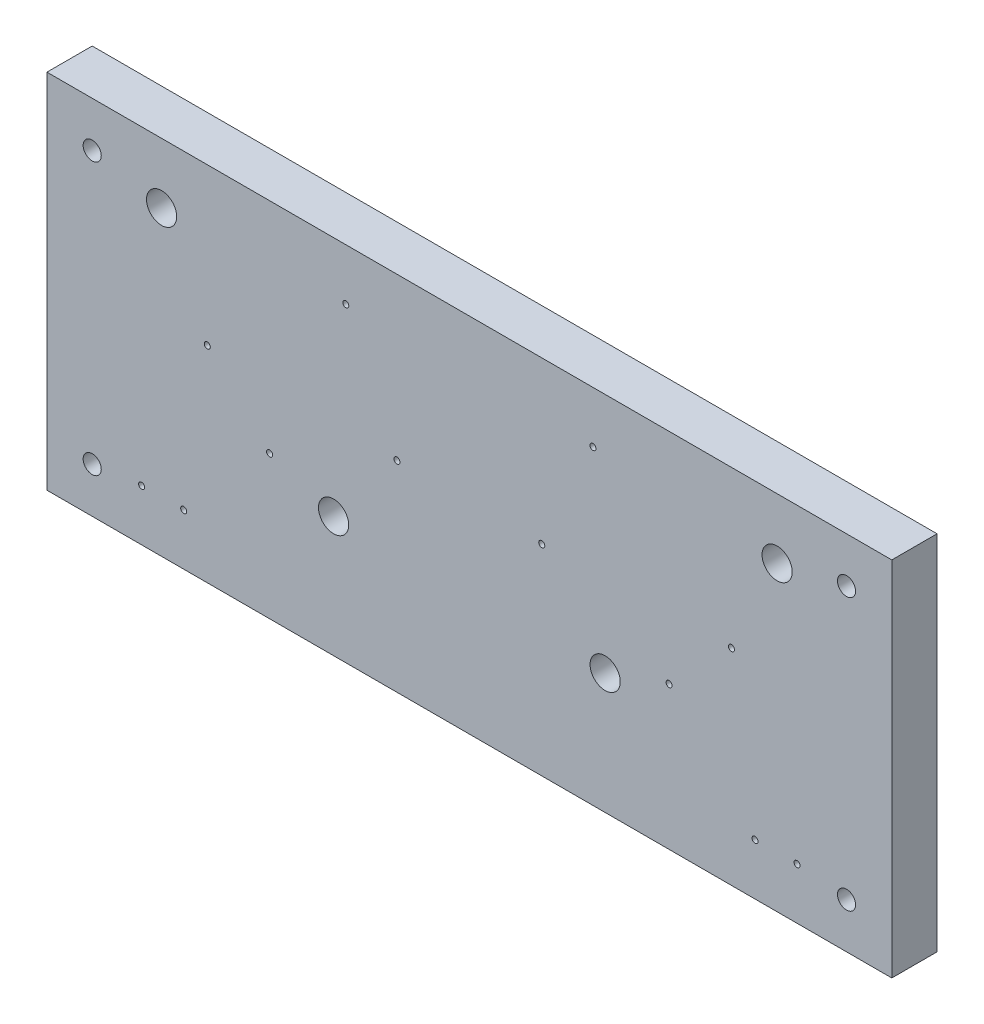
ISO-10303-21;
HEADER;
FILE_DESCRIPTION(('STEP AP214'),'2;1');
FILE_NAME('part.step','',(''),(''),'','','');
FILE_SCHEMA(('AUTOMOTIVE_DESIGN { 1 0 10303 214 1 1 1 1 }'));
ENDSEC;
DATA;
#1=APPLICATION_CONTEXT('core data for automotive mechanical design processes');
#2=APPLICATION_PROTOCOL_DEFINITION('international standard','automotive_design',2000,#1);
#3=PRODUCT_CONTEXT('',#1,'mechanical');
#4=PRODUCT('Part','Part','',(#3));
#5=PRODUCT_RELATED_PRODUCT_CATEGORY('part','',(#4));
#6=PRODUCT_DEFINITION_FORMATION('','',#4);
#7=PRODUCT_DEFINITION_CONTEXT('part definition',#1,'design');
#8=PRODUCT_DEFINITION('design','',#6,#7);
#9=PRODUCT_DEFINITION_SHAPE('','',#8);
#10=(LENGTH_UNIT() NAMED_UNIT(*) SI_UNIT(.MILLI.,.METRE.));
#11=(NAMED_UNIT(*) PLANE_ANGLE_UNIT() SI_UNIT($,.RADIAN.));
#12=(NAMED_UNIT(*) SI_UNIT($,.STERADIAN.) SOLID_ANGLE_UNIT());
#13=UNCERTAINTY_MEASURE_WITH_UNIT(LENGTH_MEASURE(1.E-05),#10,'distance_accuracy_value','');
#14=(GEOMETRIC_REPRESENTATION_CONTEXT(3) GLOBAL_UNCERTAINTY_ASSIGNED_CONTEXT((#13)) GLOBAL_UNIT_ASSIGNED_CONTEXT((#10,
#11,#12)) REPRESENTATION_CONTEXT('',''));
#15=CARTESIAN_POINT('',(0.,0.,0.));
#16=DIRECTION('',(0.,0.,1.));
#17=DIRECTION('',(1.,0.,0.));
#18=AXIS2_PLACEMENT_3D('',#15,#16,#17);
#19=CARTESIAN_POINT('',(0.,0.,15.));
#20=DIRECTION('',(0.,0.,-1.));
#21=DIRECTION('',(-1.,0.,0.));
#22=AXIS2_PLACEMENT_3D('',#19,#20,#21);
#23=PLANE('',#22);
#24=CARTESIAN_POINT('',(66.1972555919681,-12.5278266131575,15.));
#25=DIRECTION('',(0.,0.,1.));
#26=DIRECTION('',(1.,0.,0.));
#27=AXIS2_PLACEMENT_3D('',#24,#25,#26);
#28=CIRCLE('',#27,0.999999999999998);
#29=CARTESIAN_POINT('',(67.1972555919681,-12.5278266131575,15.));
#30=VERTEX_POINT('',#29);
#31=EDGE_CURVE('E261',#30,#30,#28,.T.);
#32=ORIENTED_EDGE('',*,*,#31,.F.);
#33=EDGE_LOOP('',(#32));
#34=FACE_BOUND('',#33,.T.);
#35=CARTESIAN_POINT('',(94.6633318787199,-43.,15.));
#36=DIRECTION('',(0.,0.,1.));
#37=DIRECTION('',(1.,0.,0.));
#38=AXIS2_PLACEMENT_3D('',#35,#36,#37);
#39=CIRCLE('',#38,0.999999999999998);
#40=CARTESIAN_POINT('',(95.6633318787199,-43.,15.));
#41=VERTEX_POINT('',#40);
#42=EDGE_CURVE('E260',#41,#41,#39,.T.);
#43=ORIENTED_EDGE('',*,*,#42,.F.);
#44=EDGE_LOOP('',(#43));
#45=FACE_BOUND('',#44,.T.);
#46=CARTESIAN_POINT('',(45.,-20.,15.));
#47=DIRECTION('',(0.,0.,1.));
#48=DIRECTION('',(1.,0.,0.));
#49=AXIS2_PLACEMENT_3D('',#46,#47,#48);
#50=CIRCLE('',#49,4.99999999999999);
#51=CARTESIAN_POINT('',(50.,-20.,15.));
#52=VERTEX_POINT('',#51);
#53=EDGE_CURVE('E280',#52,#52,#50,.F.);
#54=ORIENTED_EDGE('',*,*,#53,.T.);
#55=EDGE_LOOP('',(#54));
#56=FACE_BOUND('',#55,.T.);
#57=CARTESIAN_POINT('',(-102.,40.,15.));
#58=DIRECTION('',(0.,0.,1.));
#59=DIRECTION('',(1.,0.,0.));
#60=AXIS2_PLACEMENT_3D('',#57,#58,#59);
#61=CIRCLE('',#60,5.00000000000002);
#62=CARTESIAN_POINT('',(-97.,40.,15.));
#63=VERTEX_POINT('',#62);
#64=EDGE_CURVE('E274',#63,#63,#61,.T.);
#65=ORIENTED_EDGE('',*,*,#64,.F.);
#66=EDGE_LOOP('',(#65));
#67=FACE_BOUND('',#66,.T.);
#68=CARTESIAN_POINT('',(108.600249206091,-43.,15.));
#69=DIRECTION('',(0.,0.,-1.));
#70=DIRECTION('',(-1.,0.,0.));
#71=AXIS2_PLACEMENT_3D('',#68,#69,#70);
#72=CIRCLE('',#71,0.999999999999998);
#73=CARTESIAN_POINT('',(107.600249206091,-43.,15.));
#74=VERTEX_POINT('',#73);
#75=EDGE_CURVE('E264',#74,#74,#72,.T.);
#76=ORIENTED_EDGE('',*,*,#75,.T.);
#77=EDGE_LOOP('',(#76));
#78=FACE_BOUND('',#77,.T.);
#79=CARTESIAN_POINT('',(-23.9978729836266,6.52759051078482,15.));
#80=DIRECTION('',(0.,0.,1.));
#81=DIRECTION('',(1.,0.,0.));
#82=AXIS2_PLACEMENT_3D('',#79,#80,#81);
#83=CIRCLE('',#82,0.999999999999998);
#84=CARTESIAN_POINT('',(-22.9978729836266,6.52759051078482,15.));
#85=VERTEX_POINT('',#84);
#86=EDGE_CURVE('E496',#85,#85,#83,.T.);
#87=ORIENTED_EDGE('',*,*,#86,.F.);
#88=EDGE_LOOP('',(#87));
#89=FACE_BOUND('',#88,.T.);
#90=CARTESIAN_POINT('',(-86.860735425717,8.14261119141876,15.));
#91=DIRECTION('',(0.,0.,1.));
#92=DIRECTION('',(1.,0.,0.));
#93=AXIS2_PLACEMENT_3D('',#90,#91,#92);
#94=CIRCLE('',#93,0.999999999999998);
#95=CARTESIAN_POINT('',(-85.860735425717,8.14261119141876,15.));
#96=VERTEX_POINT('',#95);
#97=EDGE_CURVE('E500',#96,#96,#94,.T.);
#98=ORIENTED_EDGE('',*,*,#97,.F.);
#99=EDGE_LOOP('',(#98));
#100=FACE_BOUND('',#99,.T.);
#101=CARTESIAN_POINT('',(-108.606917327371,-43.,15.));
#102=DIRECTION('',(0.,0.,1.));
#103=DIRECTION('',(1.,0.,0.));
#104=AXIS2_PLACEMENT_3D('',#101,#102,#103);
#105=CIRCLE('',#104,0.999999999999998);
#106=CARTESIAN_POINT('',(-107.606917327371,-43.,15.));
#107=VERTEX_POINT('',#106);
#108=EDGE_CURVE('E504',#107,#107,#105,.T.);
#109=ORIENTED_EDGE('',*,*,#108,.F.);
#110=EDGE_LOOP('',(#109));
#111=FACE_BOUND('',#110,.T.);
#112=CARTESIAN_POINT('',(-124.999999999999,-45.,15.));
#113=DIRECTION('',(0.,0.,1.));
#114=DIRECTION('',(1.,0.,0.));
#115=AXIS2_PLACEMENT_3D('',#112,#113,#114);
#116=CIRCLE('',#115,3.00000000000001);
#117=CARTESIAN_POINT('',(-121.999999999999,-45.,15.));
#118=VERTEX_POINT('',#117);
#119=EDGE_CURVE('E160',#118,#118,#116,.T.);
#120=ORIENTED_EDGE('',*,*,#119,.F.);
#121=EDGE_LOOP('',(#120));
#122=FACE_BOUND('',#121,.T.);
#123=CARTESIAN_POINT('',(125.000000000001,-45.,15.));
#124=DIRECTION('',(0.,0.,1.));
#125=DIRECTION('',(1.,0.,0.));
#126=AXIS2_PLACEMENT_3D('',#123,#124,#125);
#127=CIRCLE('',#126,2.99999999999999);
#128=CARTESIAN_POINT('',(128.000000000001,-45.,15.));
#129=VERTEX_POINT('',#128);
#130=EDGE_CURVE('E169',#129,#129,#127,.T.);
#131=ORIENTED_EDGE('',*,*,#130,.F.);
#132=EDGE_LOOP('',(#131));
#133=FACE_BOUND('',#132,.T.);
#134=CARTESIAN_POINT('',(125.,45.,15.));
#135=DIRECTION('',(0.,0.,1.));
#136=DIRECTION('',(1.,0.,0.));
#137=AXIS2_PLACEMENT_3D('',#134,#135,#136);
#138=CIRCLE('',#137,2.99999999999999);
#139=CARTESIAN_POINT('',(128.,45.,15.));
#140=VERTEX_POINT('',#139);
#141=EDGE_CURVE('E175',#140,#140,#138,.T.);
#142=ORIENTED_EDGE('',*,*,#141,.F.);
#143=EDGE_LOOP('',(#142));
#144=FACE_BOUND('',#143,.T.);
#145=CARTESIAN_POINT('',(-125.,45.,15.));
#146=DIRECTION('',(0.,0.,1.));
#147=DIRECTION('',(1.,0.,0.));
#148=AXIS2_PLACEMENT_3D('',#145,#146,#147);
#149=CIRCLE('',#148,3.00000000000001);
#150=CARTESIAN_POINT('',(-122.,45.,15.));
#151=VERTEX_POINT('',#150);
#152=EDGE_CURVE('E103',#151,#151,#149,.T.);
#153=ORIENTED_EDGE('',*,*,#152,.F.);
#154=EDGE_LOOP('',(#153));
#155=FACE_BOUND('',#154,.T.);
#156=DIRECTION('',(0.,1.,0.));
#157=VECTOR('',#156,1.);
#158=CARTESIAN_POINT('',(140.,-60.,15.));
#159=LINE('',#158,#157);
#160=CARTESIAN_POINT('',(140.,-60.,15.));
#161=VERTEX_POINT('',#160);
#162=CARTESIAN_POINT('',(140.,60.,15.));
#163=VERTEX_POINT('',#162);
#164=EDGE_CURVE('E87',#161,#163,#159,.T.);
#165=ORIENTED_EDGE('',*,*,#164,.T.);
#166=DIRECTION('',(-1.,0.,0.));
#167=VECTOR('',#166,1.);
#168=CARTESIAN_POINT('',(-140.,60.,15.));
#169=LINE('',#168,#167);
#170=CARTESIAN_POINT('',(-140.,60.,15.));
#171=VERTEX_POINT('',#170);
#172=EDGE_CURVE('E82',#163,#171,#169,.T.);
#173=ORIENTED_EDGE('',*,*,#172,.T.);
#174=DIRECTION('',(0.,-1.,0.));
#175=VECTOR('',#174,1.);
#176=CARTESIAN_POINT('',(-140.,-60.,15.));
#177=LINE('',#176,#175);
#178=CARTESIAN_POINT('',(-140.,-60.,15.));
#179=VERTEX_POINT('',#178);
#180=EDGE_CURVE('E85',#171,#179,#177,.T.);
#181=ORIENTED_EDGE('',*,*,#180,.T.);
#182=DIRECTION('',(1.,0.,0.));
#183=VECTOR('',#182,1.);
#184=CARTESIAN_POINT('',(-140.,-60.,15.));
#185=LINE('',#184,#183);
#186=EDGE_CURVE('E52',#179,#161,#185,.T.);
#187=ORIENTED_EDGE('',*,*,#186,.T.);
#188=EDGE_LOOP('',(#165,#173,#181,#187));
#189=FACE_BOUND('',#188,.T.);
#190=CARTESIAN_POINT('',(102.,40.,15.));
#191=DIRECTION('',(0.,0.,1.));
#192=DIRECTION('',(1.,0.,0.));
#193=AXIS2_PLACEMENT_3D('',#190,#191,#192);
#194=CIRCLE('',#193,5.00000000000005);
#195=CARTESIAN_POINT('',(107.,40.,15.));
#196=VERTEX_POINT('',#195);
#197=EDGE_CURVE('E113',#196,#196,#194,.F.);
#198=ORIENTED_EDGE('',*,*,#197,.T.);
#199=EDGE_LOOP('',(#198));
#200=FACE_BOUND('',#199,.T.);
#201=CARTESIAN_POINT('',(-66.203923713249,-12.5278266131575,15.));
#202=DIRECTION('',(0.,0.,1.));
#203=DIRECTION('',(1.,0.,0.));
#204=AXIS2_PLACEMENT_3D('',#201,#202,#203);
#205=CIRCLE('',#204,0.999999999999998);
#206=CARTESIAN_POINT('',(-65.203923713249,-12.5278266131575,15.));
#207=VERTEX_POINT('',#206);
#208=EDGE_CURVE('E508',#207,#207,#205,.T.);
#209=ORIENTED_EDGE('',*,*,#208,.F.);
#210=EDGE_LOOP('',(#209));
#211=FACE_BOUND('',#210,.T.);
#212=CARTESIAN_POINT('',(-94.6699999999999,-43.,15.));
#213=DIRECTION('',(0.,0.,1.));
#214=DIRECTION('',(1.,0.,0.));
#215=AXIS2_PLACEMENT_3D('',#212,#213,#214);
#216=CIRCLE('',#215,0.999999999999998);
#217=CARTESIAN_POINT('',(-93.6699999999999,-43.,15.));
#218=VERTEX_POINT('',#217);
#219=EDGE_CURVE('E509',#218,#218,#216,.T.);
#220=ORIENTED_EDGE('',*,*,#219,.F.);
#221=EDGE_LOOP('',(#220));
#222=FACE_BOUND('',#221,.T.);
#223=CARTESIAN_POINT('',(-40.9612228496668,42.9056060975551,15.));
#224=DIRECTION('',(0.,0.,1.));
#225=DIRECTION('',(1.,0.,0.));
#226=AXIS2_PLACEMENT_3D('',#223,#224,#225);
#227=CIRCLE('',#226,0.999999999999998);
#228=CARTESIAN_POINT('',(-39.9612228496668,42.9056060975551,15.));
#229=VERTEX_POINT('',#228);
#230=EDGE_CURVE('E516',#229,#229,#227,.T.);
#231=ORIENTED_EDGE('',*,*,#230,.F.);
#232=EDGE_LOOP('',(#231));
#233=FACE_BOUND('',#232,.T.);
#234=CARTESIAN_POINT('',(40.9545547283859,42.9056060975552,15.));
#235=DIRECTION('',(0.,0.,1.));
#236=DIRECTION('',(1.,0.,0.));
#237=AXIS2_PLACEMENT_3D('',#234,#235,#236);
#238=CIRCLE('',#237,0.999999999999998);
#239=CARTESIAN_POINT('',(41.9545547283859,42.9056060975552,15.));
#240=VERTEX_POINT('',#239);
#241=EDGE_CURVE('E273',#240,#240,#238,.T.);
#242=ORIENTED_EDGE('',*,*,#241,.F.);
#243=EDGE_LOOP('',(#242));
#244=FACE_BOUND('',#243,.T.);
#245=CARTESIAN_POINT('',(-45.,-20.,15.));
#246=DIRECTION('',(0.,0.,1.));
#247=DIRECTION('',(1.,0.,0.));
#248=AXIS2_PLACEMENT_3D('',#245,#246,#247);
#249=CIRCLE('',#248,5.00000000000001);
#250=CARTESIAN_POINT('',(-40.,-20.,15.));
#251=VERTEX_POINT('',#250);
#252=EDGE_CURVE('E277',#251,#251,#249,.T.);
#253=ORIENTED_EDGE('',*,*,#252,.F.);
#254=EDGE_LOOP('',(#253));
#255=FACE_BOUND('',#254,.T.);
#256=CARTESIAN_POINT('',(86.8540673044364,8.14261119141895,15.));
#257=DIRECTION('',(0.,0.,1.));
#258=DIRECTION('',(1.,0.,0.));
#259=AXIS2_PLACEMENT_3D('',#256,#257,#258);
#260=CIRCLE('',#259,0.999999999999998);
#261=CARTESIAN_POINT('',(87.8540673044364,8.14261119141895,15.));
#262=VERTEX_POINT('',#261);
#263=EDGE_CURVE('E258',#262,#262,#260,.T.);
#264=ORIENTED_EDGE('',*,*,#263,.F.);
#265=EDGE_LOOP('',(#264));
#266=FACE_BOUND('',#265,.T.);
#267=CARTESIAN_POINT('',(23.9912048623457,6.52759051078482,15.));
#268=DIRECTION('',(0.,0.,1.));
#269=DIRECTION('',(1.,0.,0.));
#270=AXIS2_PLACEMENT_3D('',#267,#268,#269);
#271=CIRCLE('',#270,1.00000000000001);
#272=CARTESIAN_POINT('',(24.9912048623458,6.52759051078482,15.));
#273=VERTEX_POINT('',#272);
#274=EDGE_CURVE('E267',#273,#273,#271,.T.);
#275=ORIENTED_EDGE('',*,*,#274,.F.);
#276=EDGE_LOOP('',(#275));
#277=FACE_BOUND('',#276,.T.);
#278=ADVANCED_FACE('F33',(#34,#45,#56,#67,#78,#89,#100,#111,#122,#133,#144,#155,#189,#200,#211,
#222,#233,#244,#255,#266,#277),#23,.F.);
#279=CARTESIAN_POINT('',(0.,0.,0.));
#280=DIRECTION('',(0.,0.,-1.));
#281=DIRECTION('',(-1.,0.,0.));
#282=AXIS2_PLACEMENT_3D('',#279,#280,#281);
#283=PLANE('',#282);
#284=CARTESIAN_POINT('',(45.,-20.,0.));
#285=DIRECTION('',(0.,0.,-1.));
#286=DIRECTION('',(-1.,0.,0.));
#287=AXIS2_PLACEMENT_3D('',#284,#285,#286);
#288=CIRCLE('',#287,4.99999999999999);
#289=CARTESIAN_POINT('',(40.,-20.,0.));
#290=VERTEX_POINT('',#289);
#291=EDGE_CURVE('E143',#290,#290,#288,.F.);
#292=ORIENTED_EDGE('',*,*,#291,.T.);
#293=EDGE_LOOP('',(#292));
#294=FACE_BOUND('',#293,.T.);
#295=CARTESIAN_POINT('',(108.600249206091,-43.,0.));
#296=DIRECTION('',(0.,0.,-1.));
#297=DIRECTION('',(-1.,0.,0.));
#298=AXIS2_PLACEMENT_3D('',#295,#296,#297);
#299=CIRCLE('',#298,0.999999999999998);
#300=CARTESIAN_POINT('',(107.600249206091,-43.,0.));
#301=VERTEX_POINT('',#300);
#302=EDGE_CURVE('E134',#301,#301,#299,.F.);
#303=ORIENTED_EDGE('',*,*,#302,.T.);
#304=EDGE_LOOP('',(#303));
#305=FACE_BOUND('',#304,.T.);
#306=CARTESIAN_POINT('',(102.,40.,0.));
#307=DIRECTION('',(0.,0.,-1.));
#308=DIRECTION('',(-1.,0.,0.));
#309=AXIS2_PLACEMENT_3D('',#306,#307,#308);
#310=CIRCLE('',#309,5.00000000000005);
#311=CARTESIAN_POINT('',(97.,40.,0.));
#312=VERTEX_POINT('',#311);
#313=EDGE_CURVE('E109',#312,#312,#310,.F.);
#314=ORIENTED_EDGE('',*,*,#313,.T.);
#315=EDGE_LOOP('',(#314));
#316=FACE_BOUND('',#315,.T.);
#317=CARTESIAN_POINT('',(125.000000000001,-45.,0.));
#318=DIRECTION('',(0.,0.,1.));
#319=DIRECTION('',(1.,0.,0.));
#320=AXIS2_PLACEMENT_3D('',#317,#318,#319);
#321=CIRCLE('',#320,2.99999999999999);
#322=CARTESIAN_POINT('',(128.000000000001,-45.,0.));
#323=VERTEX_POINT('',#322);
#324=EDGE_CURVE('E165',#323,#323,#321,.T.);
#325=ORIENTED_EDGE('',*,*,#324,.T.);
#326=EDGE_LOOP('',(#325));
#327=FACE_BOUND('',#326,.T.);
#328=CARTESIAN_POINT('',(-125.,45.,0.));
#329=DIRECTION('',(0.,0.,1.));
#330=DIRECTION('',(1.,0.,0.));
#331=AXIS2_PLACEMENT_3D('',#328,#329,#330);
#332=CIRCLE('',#331,3.00000000000001);
#333=CARTESIAN_POINT('',(-122.,45.,0.));
#334=VERTEX_POINT('',#333);
#335=EDGE_CURVE('E178',#334,#334,#332,.T.);
#336=ORIENTED_EDGE('',*,*,#335,.T.);
#337=EDGE_LOOP('',(#336));
#338=FACE_BOUND('',#337,.T.);
#339=DIRECTION('',(0.,1.,0.));
#340=VECTOR('',#339,1.);
#341=CARTESIAN_POINT('',(140.,-60.,0.));
#342=LINE('',#341,#340);
#343=CARTESIAN_POINT('',(140.,-60.,0.));
#344=VERTEX_POINT('',#343);
#345=CARTESIAN_POINT('',(140.,60.,0.));
#346=VERTEX_POINT('',#345);
#347=EDGE_CURVE('E100',#344,#346,#342,.T.);
#348=ORIENTED_EDGE('',*,*,#347,.F.);
#349=DIRECTION('',(1.,0.,0.));
#350=VECTOR('',#349,1.);
#351=CARTESIAN_POINT('',(-140.,-60.,0.));
#352=LINE('',#351,#350);
#353=CARTESIAN_POINT('',(-140.,-60.,0.));
#354=VERTEX_POINT('',#353);
#355=EDGE_CURVE('E75',#354,#344,#352,.T.);
#356=ORIENTED_EDGE('',*,*,#355,.F.);
#357=DIRECTION('',(0.,-1.,0.));
#358=VECTOR('',#357,1.);
#359=CARTESIAN_POINT('',(-140.,-60.,0.));
#360=LINE('',#359,#358);
#361=CARTESIAN_POINT('',(-140.,60.,0.));
#362=VERTEX_POINT('',#361);
#363=EDGE_CURVE('E69',#362,#354,#360,.T.);
#364=ORIENTED_EDGE('',*,*,#363,.F.);
#365=DIRECTION('',(-1.,0.,0.));
#366=VECTOR('',#365,1.);
#367=CARTESIAN_POINT('',(-140.,60.,0.));
#368=LINE('',#367,#366);
#369=EDGE_CURVE('E91',#346,#362,#368,.T.);
#370=ORIENTED_EDGE('',*,*,#369,.F.);
#371=EDGE_LOOP('',(#348,#356,#364,#370));
#372=FACE_BOUND('',#371,.T.);
#373=CARTESIAN_POINT('',(125.,45.,0.));
#374=DIRECTION('',(0.,0.,1.));
#375=DIRECTION('',(1.,0.,0.));
#376=AXIS2_PLACEMENT_3D('',#373,#374,#375);
#377=CIRCLE('',#376,2.99999999999999);
#378=CARTESIAN_POINT('',(128.,45.,0.));
#379=VERTEX_POINT('',#378);
#380=EDGE_CURVE('E172',#379,#379,#377,.T.);
#381=ORIENTED_EDGE('',*,*,#380,.T.);
#382=EDGE_LOOP('',(#381));
#383=FACE_BOUND('',#382,.T.);
#384=CARTESIAN_POINT('',(-124.999999999999,-45.,0.));
#385=DIRECTION('',(0.,0.,1.));
#386=DIRECTION('',(1.,0.,0.));
#387=AXIS2_PLACEMENT_3D('',#384,#385,#386);
#388=CIRCLE('',#387,3.00000000000001);
#389=CARTESIAN_POINT('',(-121.999999999999,-45.,0.));
#390=VERTEX_POINT('',#389);
#391=EDGE_CURVE('E156',#390,#390,#388,.T.);
#392=ORIENTED_EDGE('',*,*,#391,.T.);
#393=EDGE_LOOP('',(#392));
#394=FACE_BOUND('',#393,.T.);
#395=CARTESIAN_POINT('',(-66.203923713249,-12.5278266131575,0.));
#396=DIRECTION('',(0.,0.,-1.));
#397=DIRECTION('',(-1.,0.,0.));
#398=AXIS2_PLACEMENT_3D('',#395,#396,#397);
#399=CIRCLE('',#398,0.999999999999998);
#400=CARTESIAN_POINT('',(-67.203923713249,-12.5278266131575,0.));
#401=VERTEX_POINT('',#400);
#402=EDGE_CURVE('E112',#401,#401,#399,.T.);
#403=ORIENTED_EDGE('',*,*,#402,.F.);
#404=EDGE_LOOP('',(#403));
#405=FACE_BOUND('',#404,.T.);
#406=CARTESIAN_POINT('',(-108.606917327371,-43.,0.));
#407=DIRECTION('',(0.,0.,-1.));
#408=DIRECTION('',(-1.,0.,0.));
#409=AXIS2_PLACEMENT_3D('',#406,#407,#408);
#410=CIRCLE('',#409,0.999999999999998);
#411=CARTESIAN_POINT('',(-109.606917327371,-43.,0.));
#412=VERTEX_POINT('',#411);
#413=EDGE_CURVE('E116',#412,#412,#410,.T.);
#414=ORIENTED_EDGE('',*,*,#413,.F.);
#415=EDGE_LOOP('',(#414));
#416=FACE_BOUND('',#415,.T.);
#417=CARTESIAN_POINT('',(-94.6699999999999,-43.,0.));
#418=DIRECTION('',(0.,0.,-1.));
#419=DIRECTION('',(-1.,0.,0.));
#420=AXIS2_PLACEMENT_3D('',#417,#418,#419);
#421=CIRCLE('',#420,0.999999999999998);
#422=CARTESIAN_POINT('',(-95.6699999999999,-43.,0.));
#423=VERTEX_POINT('',#422);
#424=EDGE_CURVE('E119',#423,#423,#421,.T.);
#425=ORIENTED_EDGE('',*,*,#424,.F.);
#426=EDGE_LOOP('',(#425));
#427=FACE_BOUND('',#426,.T.);
#428=CARTESIAN_POINT('',(-86.860735425717,8.14261119141876,0.));
#429=DIRECTION('',(0.,0.,-1.));
#430=DIRECTION('',(-1.,0.,0.));
#431=AXIS2_PLACEMENT_3D('',#428,#429,#430);
#432=CIRCLE('',#431,0.999999999999998);
#433=CARTESIAN_POINT('',(-87.860735425717,8.14261119141876,0.));
#434=VERTEX_POINT('',#433);
#435=EDGE_CURVE('E122',#434,#434,#432,.T.);
#436=ORIENTED_EDGE('',*,*,#435,.F.);
#437=EDGE_LOOP('',(#436));
#438=FACE_BOUND('',#437,.T.);
#439=CARTESIAN_POINT('',(-40.9612228496668,42.9056060975551,0.));
#440=DIRECTION('',(0.,0.,-1.));
#441=DIRECTION('',(-1.,0.,0.));
#442=AXIS2_PLACEMENT_3D('',#439,#440,#441);
#443=CIRCLE('',#442,0.999999999999998);
#444=CARTESIAN_POINT('',(-41.9612228496668,42.9056060975551,0.));
#445=VERTEX_POINT('',#444);
#446=EDGE_CURVE('E125',#445,#445,#443,.T.);
#447=ORIENTED_EDGE('',*,*,#446,.F.);
#448=EDGE_LOOP('',(#447));
#449=FACE_BOUND('',#448,.T.);
#450=CARTESIAN_POINT('',(-23.9978729836266,6.52759051078482,0.));
#451=DIRECTION('',(0.,0.,-1.));
#452=DIRECTION('',(-1.,0.,0.));
#453=AXIS2_PLACEMENT_3D('',#450,#451,#452);
#454=CIRCLE('',#453,0.999999999999998);
#455=CARTESIAN_POINT('',(-24.9978729836266,6.52759051078482,0.));
#456=VERTEX_POINT('',#455);
#457=EDGE_CURVE('E128',#456,#456,#454,.T.);
#458=ORIENTED_EDGE('',*,*,#457,.F.);
#459=EDGE_LOOP('',(#458));
#460=FACE_BOUND('',#459,.T.);
#461=CARTESIAN_POINT('',(40.9545547283859,42.9056060975552,0.));
#462=DIRECTION('',(0.,0.,-1.));
#463=DIRECTION('',(-1.,0.,0.));
#464=AXIS2_PLACEMENT_3D('',#461,#462,#463);
#465=CIRCLE('',#464,0.999999999999998);
#466=CARTESIAN_POINT('',(39.9545547283859,42.9056060975552,0.));
#467=VERTEX_POINT('',#466);
#468=EDGE_CURVE('E131',#467,#467,#465,.T.);
#469=ORIENTED_EDGE('',*,*,#468,.F.);
#470=EDGE_LOOP('',(#469));
#471=FACE_BOUND('',#470,.T.);
#472=CARTESIAN_POINT('',(-102.,40.,0.));
#473=DIRECTION('',(0.,0.,-1.));
#474=DIRECTION('',(-1.,0.,0.));
#475=AXIS2_PLACEMENT_3D('',#472,#473,#474);
#476=CIRCLE('',#475,5.00000000000002);
#477=CARTESIAN_POINT('',(-107.,40.,0.));
#478=VERTEX_POINT('',#477);
#479=EDGE_CURVE('E137',#478,#478,#476,.T.);
#480=ORIENTED_EDGE('',*,*,#479,.F.);
#481=EDGE_LOOP('',(#480));
#482=FACE_BOUND('',#481,.T.);
#483=CARTESIAN_POINT('',(-45.,-20.,0.));
#484=DIRECTION('',(0.,0.,-1.));
#485=DIRECTION('',(-1.,0.,0.));
#486=AXIS2_PLACEMENT_3D('',#483,#484,#485);
#487=CIRCLE('',#486,5.00000000000001);
#488=CARTESIAN_POINT('',(-50.,-20.,0.));
#489=VERTEX_POINT('',#488);
#490=EDGE_CURVE('E140',#489,#489,#487,.T.);
#491=ORIENTED_EDGE('',*,*,#490,.F.);
#492=EDGE_LOOP('',(#491));
#493=FACE_BOUND('',#492,.T.);
#494=CARTESIAN_POINT('',(94.6633318787199,-43.,0.));
#495=DIRECTION('',(0.,0.,-1.));
#496=DIRECTION('',(-1.,0.,0.));
#497=AXIS2_PLACEMENT_3D('',#494,#495,#496);
#498=CIRCLE('',#497,0.999999999999998);
#499=CARTESIAN_POINT('',(93.6633318787199,-43.,0.));
#500=VERTEX_POINT('',#499);
#501=EDGE_CURVE('E146',#500,#500,#498,.T.);
#502=ORIENTED_EDGE('',*,*,#501,.F.);
#503=EDGE_LOOP('',(#502));
#504=FACE_BOUND('',#503,.T.);
#505=CARTESIAN_POINT('',(86.8540673044364,8.14261119141895,0.));
#506=DIRECTION('',(0.,0.,-1.));
#507=DIRECTION('',(-1.,0.,0.));
#508=AXIS2_PLACEMENT_3D('',#505,#506,#507);
#509=CIRCLE('',#508,0.999999999999998);
#510=CARTESIAN_POINT('',(85.8540673044364,8.14261119141895,0.));
#511=VERTEX_POINT('',#510);
#512=EDGE_CURVE('E149',#511,#511,#509,.T.);
#513=ORIENTED_EDGE('',*,*,#512,.F.);
#514=EDGE_LOOP('',(#513));
#515=FACE_BOUND('',#514,.T.);
#516=CARTESIAN_POINT('',(66.1972555919681,-12.5278266131575,0.));
#517=DIRECTION('',(0.,0.,-1.));
#518=DIRECTION('',(-1.,0.,0.));
#519=AXIS2_PLACEMENT_3D('',#516,#517,#518);
#520=CIRCLE('',#519,0.999999999999998);
#521=CARTESIAN_POINT('',(65.1972555919681,-12.5278266131575,0.));
#522=VERTEX_POINT('',#521);
#523=EDGE_CURVE('E151',#522,#522,#520,.T.);
#524=ORIENTED_EDGE('',*,*,#523,.F.);
#525=EDGE_LOOP('',(#524));
#526=FACE_BOUND('',#525,.T.);
#527=CARTESIAN_POINT('',(23.9912048623457,6.52759051078482,0.));
#528=DIRECTION('',(0.,0.,-1.));
#529=DIRECTION('',(-1.,0.,0.));
#530=AXIS2_PLACEMENT_3D('',#527,#528,#529);
#531=CIRCLE('',#530,1.00000000000001);
#532=CARTESIAN_POINT('',(22.9912048623457,6.52759051078482,0.));
#533=VERTEX_POINT('',#532);
#534=EDGE_CURVE('E37',#533,#533,#531,.T.);
#535=ORIENTED_EDGE('',*,*,#534,.F.);
#536=EDGE_LOOP('',(#535));
#537=FACE_BOUND('',#536,.T.);
#538=ADVANCED_FACE('F186',(#294,#305,#316,#327,#338,#372,#383,#394,#405,#416,#427,#438,#449,
#460,#471,#482,#493,#504,#515,#526,#537),#283,.T.);
#539=CARTESIAN_POINT('',(140.,-60.,15.));
#540=DIRECTION('',(-1.,0.,0.));
#541=DIRECTION('',(0.,-1.,0.));
#542=AXIS2_PLACEMENT_3D('',#539,#540,#541);
#543=PLANE('',#542);
#544=ORIENTED_EDGE('',*,*,#347,.T.);
#545=DIRECTION('',(0.,0.,-1.));
#546=VECTOR('',#545,1.);
#547=CARTESIAN_POINT('',(140.,60.,15.));
#548=LINE('',#547,#546);
#549=EDGE_CURVE('E11',#163,#346,#548,.T.);
#550=ORIENTED_EDGE('',*,*,#549,.F.);
#551=ORIENTED_EDGE('',*,*,#164,.F.);
#552=DIRECTION('',(0.,0.,-1.));
#553=VECTOR('',#552,1.);
#554=CARTESIAN_POINT('',(140.,-60.,15.));
#555=LINE('',#554,#553);
#556=EDGE_CURVE('E96',#161,#344,#555,.T.);
#557=ORIENTED_EDGE('',*,*,#556,.T.);
#558=EDGE_LOOP('',(#544,#550,#551,#557));
#559=FACE_BOUND('',#558,.T.);
#560=ADVANCED_FACE('F35',(#559),#543,.F.);
#561=CARTESIAN_POINT('',(-140.,60.,15.));
#562=DIRECTION('',(0.,-1.,0.));
#563=DIRECTION('',(0.,0.,-1.));
#564=AXIS2_PLACEMENT_3D('',#561,#562,#563);
#565=PLANE('',#564);
#566=ORIENTED_EDGE('',*,*,#369,.T.);
#567=DIRECTION('',(0.,0.,-1.));
#568=VECTOR('',#567,1.);
#569=CARTESIAN_POINT('',(-140.,60.,15.));
#570=LINE('',#569,#568);
#571=EDGE_CURVE('E43',#171,#362,#570,.T.);
#572=ORIENTED_EDGE('',*,*,#571,.F.);
#573=ORIENTED_EDGE('',*,*,#172,.F.);
#574=ORIENTED_EDGE('',*,*,#549,.T.);
#575=EDGE_LOOP('',(#566,#572,#573,#574));
#576=FACE_BOUND('',#575,.T.);
#577=ADVANCED_FACE('F90',(#576),#565,.F.);
#578=CARTESIAN_POINT('',(-140.,-60.,15.));
#579=DIRECTION('',(1.,0.,0.));
#580=DIRECTION('',(0.,1.,0.));
#581=AXIS2_PLACEMENT_3D('',#578,#579,#580);
#582=PLANE('',#581);
#583=ORIENTED_EDGE('',*,*,#363,.T.);
#584=DIRECTION('',(0.,0.,-1.));
#585=VECTOR('',#584,1.);
#586=CARTESIAN_POINT('',(-140.,-60.,15.));
#587=LINE('',#586,#585);
#588=EDGE_CURVE('E92',#179,#354,#587,.T.);
#589=ORIENTED_EDGE('',*,*,#588,.F.);
#590=ORIENTED_EDGE('',*,*,#180,.F.);
#591=ORIENTED_EDGE('',*,*,#571,.T.);
#592=EDGE_LOOP('',(#583,#589,#590,#591));
#593=FACE_BOUND('',#592,.T.);
#594=ADVANCED_FACE('F94',(#593),#582,.F.);
#595=CARTESIAN_POINT('',(-140.,-60.,15.));
#596=DIRECTION('',(0.,1.,0.));
#597=DIRECTION('',(0.,0.,1.));
#598=AXIS2_PLACEMENT_3D('',#595,#596,#597);
#599=PLANE('',#598);
#600=ORIENTED_EDGE('',*,*,#355,.T.);
#601=ORIENTED_EDGE('',*,*,#556,.F.);
#602=ORIENTED_EDGE('',*,*,#186,.F.);
#603=ORIENTED_EDGE('',*,*,#588,.T.);
#604=EDGE_LOOP('',(#600,#601,#602,#603));
#605=FACE_BOUND('',#604,.T.);
#606=ADVANCED_FACE('F192',(#605),#599,.F.);
#607=CARTESIAN_POINT('',(-125.,45.,15.));
#608=DIRECTION('',(0.,0.,-1.));
#609=DIRECTION('',(-1.,0.,0.));
#610=AXIS2_PLACEMENT_3D('',#607,#608,#609);
#611=CYLINDRICAL_SURFACE('',#610,3.00000000000001);
#612=ORIENTED_EDGE('',*,*,#152,.T.);
#613=EDGE_LOOP('',(#612));
#614=FACE_BOUND('',#613,.T.);
#615=ORIENTED_EDGE('',*,*,#335,.F.);
#616=EDGE_LOOP('',(#615));
#617=FACE_BOUND('',#616,.T.);
#618=ADVANCED_FACE('F189',(#614,#617),#611,.F.);
#619=CARTESIAN_POINT('',(125.,45.,15.));
#620=DIRECTION('',(0.,0.,-1.));
#621=DIRECTION('',(-1.,0.,0.));
#622=AXIS2_PLACEMENT_3D('',#619,#620,#621);
#623=CYLINDRICAL_SURFACE('',#622,2.99999999999999);
#624=ORIENTED_EDGE('',*,*,#141,.T.);
#625=EDGE_LOOP('',(#624));
#626=FACE_BOUND('',#625,.T.);
#627=ORIENTED_EDGE('',*,*,#380,.F.);
#628=EDGE_LOOP('',(#627));
#629=FACE_BOUND('',#628,.T.);
#630=ADVANCED_FACE('F191',(#626,#629),#623,.F.);
#631=CARTESIAN_POINT('',(125.000000000001,-45.,15.));
#632=DIRECTION('',(0.,0.,-1.));
#633=DIRECTION('',(-1.,0.,0.));
#634=AXIS2_PLACEMENT_3D('',#631,#632,#633);
#635=CYLINDRICAL_SURFACE('',#634,2.99999999999999);
#636=ORIENTED_EDGE('',*,*,#130,.T.);
#637=EDGE_LOOP('',(#636));
#638=FACE_BOUND('',#637,.T.);
#639=ORIENTED_EDGE('',*,*,#324,.F.);
#640=EDGE_LOOP('',(#639));
#641=FACE_BOUND('',#640,.T.);
#642=ADVANCED_FACE('F199',(#638,#641),#635,.F.);
#643=CARTESIAN_POINT('',(-124.999999999999,-45.,15.));
#644=DIRECTION('',(0.,0.,-1.));
#645=DIRECTION('',(-1.,0.,0.));
#646=AXIS2_PLACEMENT_3D('',#643,#644,#645);
#647=CYLINDRICAL_SURFACE('',#646,3.00000000000001);
#648=ORIENTED_EDGE('',*,*,#119,.T.);
#649=EDGE_LOOP('',(#648));
#650=FACE_BOUND('',#649,.T.);
#651=ORIENTED_EDGE('',*,*,#391,.F.);
#652=EDGE_LOOP('',(#651));
#653=FACE_BOUND('',#652,.T.);
#654=ADVANCED_FACE('F291',(#650,#653),#647,.F.);
#655=CARTESIAN_POINT('',(102.,40.,-15.));
#656=DIRECTION('',(0.,0.,1.));
#657=DIRECTION('',(1.,0.,0.));
#658=AXIS2_PLACEMENT_3D('',#655,#656,#657);
#659=CYLINDRICAL_SURFACE('',#658,5.00000000000005);
#660=ORIENTED_EDGE('',*,*,#313,.F.);
#661=EDGE_LOOP('',(#660));
#662=FACE_BOUND('',#661,.T.);
#663=ORIENTED_EDGE('',*,*,#197,.F.);
#664=EDGE_LOOP('',(#663));
#665=FACE_BOUND('',#664,.T.);
#666=ADVANCED_FACE('F288',(#662,#665),#659,.F.);
#667=CARTESIAN_POINT('',(-66.203923713249,-12.5278266131575,-15.));
#668=DIRECTION('',(0.,0.,1.));
#669=DIRECTION('',(1.,0.,0.));
#670=AXIS2_PLACEMENT_3D('',#667,#668,#669);
#671=CYLINDRICAL_SURFACE('',#670,0.999999999999998);
#672=ORIENTED_EDGE('',*,*,#402,.T.);
#673=EDGE_LOOP('',(#672));
#674=FACE_BOUND('',#673,.T.);
#675=ORIENTED_EDGE('',*,*,#208,.T.);
#676=EDGE_LOOP('',(#675));
#677=FACE_BOUND('',#676,.T.);
#678=ADVANCED_FACE('F290',(#674,#677),#671,.F.);
#679=CARTESIAN_POINT('',(-108.606917327371,-43.,-15.));
#680=DIRECTION('',(0.,0.,1.));
#681=DIRECTION('',(1.,0.,0.));
#682=AXIS2_PLACEMENT_3D('',#679,#680,#681);
#683=CYLINDRICAL_SURFACE('',#682,0.999999999999998);
#684=ORIENTED_EDGE('',*,*,#413,.T.);
#685=EDGE_LOOP('',(#684));
#686=FACE_BOUND('',#685,.T.);
#687=ORIENTED_EDGE('',*,*,#108,.T.);
#688=EDGE_LOOP('',(#687));
#689=FACE_BOUND('',#688,.T.);
#690=ADVANCED_FACE('F298',(#686,#689),#683,.F.);
#691=CARTESIAN_POINT('',(-94.6699999999999,-43.,-15.));
#692=DIRECTION('',(0.,0.,1.));
#693=DIRECTION('',(1.,0.,0.));
#694=AXIS2_PLACEMENT_3D('',#691,#692,#693);
#695=CYLINDRICAL_SURFACE('',#694,0.999999999999998);
#696=ORIENTED_EDGE('',*,*,#424,.T.);
#697=EDGE_LOOP('',(#696));
#698=FACE_BOUND('',#697,.T.);
#699=ORIENTED_EDGE('',*,*,#219,.T.);
#700=EDGE_LOOP('',(#699));
#701=FACE_BOUND('',#700,.T.);
#702=ADVANCED_FACE('F357',(#698,#701),#695,.F.);
#703=CARTESIAN_POINT('',(-86.860735425717,8.14261119141876,-15.));
#704=DIRECTION('',(0.,0.,1.));
#705=DIRECTION('',(1.,0.,0.));
#706=AXIS2_PLACEMENT_3D('',#703,#704,#705);
#707=CYLINDRICAL_SURFACE('',#706,0.999999999999998);
#708=ORIENTED_EDGE('',*,*,#435,.T.);
#709=EDGE_LOOP('',(#708));
#710=FACE_BOUND('',#709,.T.);
#711=ORIENTED_EDGE('',*,*,#97,.T.);
#712=EDGE_LOOP('',(#711));
#713=FACE_BOUND('',#712,.T.);
#714=ADVANCED_FACE('F367',(#710,#713),#707,.F.);
#715=CARTESIAN_POINT('',(-40.9612228496668,42.9056060975551,-15.));
#716=DIRECTION('',(0.,0.,1.));
#717=DIRECTION('',(1.,0.,0.));
#718=AXIS2_PLACEMENT_3D('',#715,#716,#717);
#719=CYLINDRICAL_SURFACE('',#718,0.999999999999998);
#720=ORIENTED_EDGE('',*,*,#446,.T.);
#721=EDGE_LOOP('',(#720));
#722=FACE_BOUND('',#721,.T.);
#723=ORIENTED_EDGE('',*,*,#230,.T.);
#724=EDGE_LOOP('',(#723));
#725=FACE_BOUND('',#724,.T.);
#726=ADVANCED_FACE('F377',(#722,#725),#719,.F.);
#727=CARTESIAN_POINT('',(-23.9978729836266,6.52759051078482,-15.));
#728=DIRECTION('',(0.,0.,1.));
#729=DIRECTION('',(1.,0.,0.));
#730=AXIS2_PLACEMENT_3D('',#727,#728,#729);
#731=CYLINDRICAL_SURFACE('',#730,0.999999999999998);
#732=ORIENTED_EDGE('',*,*,#457,.T.);
#733=EDGE_LOOP('',(#732));
#734=FACE_BOUND('',#733,.T.);
#735=ORIENTED_EDGE('',*,*,#86,.T.);
#736=EDGE_LOOP('',(#735));
#737=FACE_BOUND('',#736,.T.);
#738=ADVANCED_FACE('F387',(#734,#737),#731,.F.);
#739=CARTESIAN_POINT('',(40.9545547283859,42.9056060975552,-15.));
#740=DIRECTION('',(0.,0.,1.));
#741=DIRECTION('',(1.,0.,0.));
#742=AXIS2_PLACEMENT_3D('',#739,#740,#741);
#743=CYLINDRICAL_SURFACE('',#742,0.999999999999998);
#744=ORIENTED_EDGE('',*,*,#468,.T.);
#745=EDGE_LOOP('',(#744));
#746=FACE_BOUND('',#745,.T.);
#747=ORIENTED_EDGE('',*,*,#241,.T.);
#748=EDGE_LOOP('',(#747));
#749=FACE_BOUND('',#748,.T.);
#750=ADVANCED_FACE('F397',(#746,#749),#743,.F.);
#751=CARTESIAN_POINT('',(108.600249206091,-43.,-15.));
#752=DIRECTION('',(0.,0.,1.));
#753=DIRECTION('',(1.,0.,0.));
#754=AXIS2_PLACEMENT_3D('',#751,#752,#753);
#755=CYLINDRICAL_SURFACE('',#754,0.999999999999998);
#756=ORIENTED_EDGE('',*,*,#302,.F.);
#757=EDGE_LOOP('',(#756));
#758=FACE_BOUND('',#757,.T.);
#759=ORIENTED_EDGE('',*,*,#75,.F.);
#760=EDGE_LOOP('',(#759));
#761=FACE_BOUND('',#760,.T.);
#762=ADVANCED_FACE('F407',(#758,#761),#755,.F.);
#763=CARTESIAN_POINT('',(-102.,40.,-15.));
#764=DIRECTION('',(0.,0.,1.));
#765=DIRECTION('',(1.,0.,0.));
#766=AXIS2_PLACEMENT_3D('',#763,#764,#765);
#767=CYLINDRICAL_SURFACE('',#766,5.00000000000002);
#768=ORIENTED_EDGE('',*,*,#479,.T.);
#769=EDGE_LOOP('',(#768));
#770=FACE_BOUND('',#769,.T.);
#771=ORIENTED_EDGE('',*,*,#64,.T.);
#772=EDGE_LOOP('',(#771));
#773=FACE_BOUND('',#772,.T.);
#774=ADVANCED_FACE('F417',(#770,#773),#767,.F.);
#775=CARTESIAN_POINT('',(-45.,-20.,-15.));
#776=DIRECTION('',(0.,0.,1.));
#777=DIRECTION('',(1.,0.,0.));
#778=AXIS2_PLACEMENT_3D('',#775,#776,#777);
#779=CYLINDRICAL_SURFACE('',#778,5.00000000000001);
#780=ORIENTED_EDGE('',*,*,#490,.T.);
#781=EDGE_LOOP('',(#780));
#782=FACE_BOUND('',#781,.T.);
#783=ORIENTED_EDGE('',*,*,#252,.T.);
#784=EDGE_LOOP('',(#783));
#785=FACE_BOUND('',#784,.T.);
#786=ADVANCED_FACE('F305',(#782,#785),#779,.F.);
#787=CARTESIAN_POINT('',(45.,-20.,-15.));
#788=DIRECTION('',(0.,0.,1.));
#789=DIRECTION('',(1.,0.,0.));
#790=AXIS2_PLACEMENT_3D('',#787,#788,#789);
#791=CYLINDRICAL_SURFACE('',#790,4.99999999999999);
#792=ORIENTED_EDGE('',*,*,#291,.F.);
#793=EDGE_LOOP('',(#792));
#794=FACE_BOUND('',#793,.T.);
#795=ORIENTED_EDGE('',*,*,#53,.F.);
#796=EDGE_LOOP('',(#795));
#797=FACE_BOUND('',#796,.T.);
#798=ADVANCED_FACE('F436',(#794,#797),#791,.F.);
#799=CARTESIAN_POINT('',(94.6633318787199,-43.,-15.));
#800=DIRECTION('',(0.,0.,1.));
#801=DIRECTION('',(1.,0.,0.));
#802=AXIS2_PLACEMENT_3D('',#799,#800,#801);
#803=CYLINDRICAL_SURFACE('',#802,0.999999999999998);
#804=ORIENTED_EDGE('',*,*,#501,.T.);
#805=EDGE_LOOP('',(#804));
#806=FACE_BOUND('',#805,.T.);
#807=ORIENTED_EDGE('',*,*,#42,.T.);
#808=EDGE_LOOP('',(#807));
#809=FACE_BOUND('',#808,.T.);
#810=ADVANCED_FACE('F254',(#806,#809),#803,.F.);
#811=CARTESIAN_POINT('',(86.8540673044364,8.14261119141895,-15.));
#812=DIRECTION('',(0.,0.,1.));
#813=DIRECTION('',(1.,0.,0.));
#814=AXIS2_PLACEMENT_3D('',#811,#812,#813);
#815=CYLINDRICAL_SURFACE('',#814,0.999999999999998);
#816=ORIENTED_EDGE('',*,*,#512,.T.);
#817=EDGE_LOOP('',(#816));
#818=FACE_BOUND('',#817,.T.);
#819=ORIENTED_EDGE('',*,*,#263,.T.);
#820=EDGE_LOOP('',(#819));
#821=FACE_BOUND('',#820,.T.);
#822=ADVANCED_FACE('F250',(#818,#821),#815,.F.);
#823=CARTESIAN_POINT('',(66.1972555919681,-12.5278266131575,-15.));
#824=DIRECTION('',(0.,0.,1.));
#825=DIRECTION('',(1.,0.,0.));
#826=AXIS2_PLACEMENT_3D('',#823,#824,#825);
#827=CYLINDRICAL_SURFACE('',#826,0.999999999999998);
#828=ORIENTED_EDGE('',*,*,#523,.T.);
#829=EDGE_LOOP('',(#828));
#830=FACE_BOUND('',#829,.T.);
#831=ORIENTED_EDGE('',*,*,#31,.T.);
#832=EDGE_LOOP('',(#831));
#833=FACE_BOUND('',#832,.T.);
#834=ADVANCED_FACE('F253',(#830,#833),#827,.F.);
#835=CARTESIAN_POINT('',(23.9912048623457,6.52759051078482,-15.));
#836=DIRECTION('',(0.,0.,1.));
#837=DIRECTION('',(1.,0.,0.));
#838=AXIS2_PLACEMENT_3D('',#835,#836,#837);
#839=CYLINDRICAL_SURFACE('',#838,1.00000000000001);
#840=ORIENTED_EDGE('',*,*,#534,.T.);
#841=EDGE_LOOP('',(#840));
#842=FACE_BOUND('',#841,.T.);
#843=ORIENTED_EDGE('',*,*,#274,.T.);
#844=EDGE_LOOP('',(#843));
#845=FACE_BOUND('',#844,.T.);
#846=ADVANCED_FACE('F468',(#842,#845),#839,.F.);
#847=CLOSED_SHELL('',(#278,#538,#560,#577,#594,#606,#618,#630,#642,#654,#666,#678,#690,#702,
#714,#726,#738,#750,#762,#774,#786,#798,#810,#822,#834,#846));
#848=MANIFOLD_SOLID_BREP('B2',#847);
#849=ADVANCED_BREP_SHAPE_REPRESENTATION('',(#18,#848),#14);
#850=SHAPE_DEFINITION_REPRESENTATION(#9,#849);
ENDSEC;
END-ISO-10303-21;
